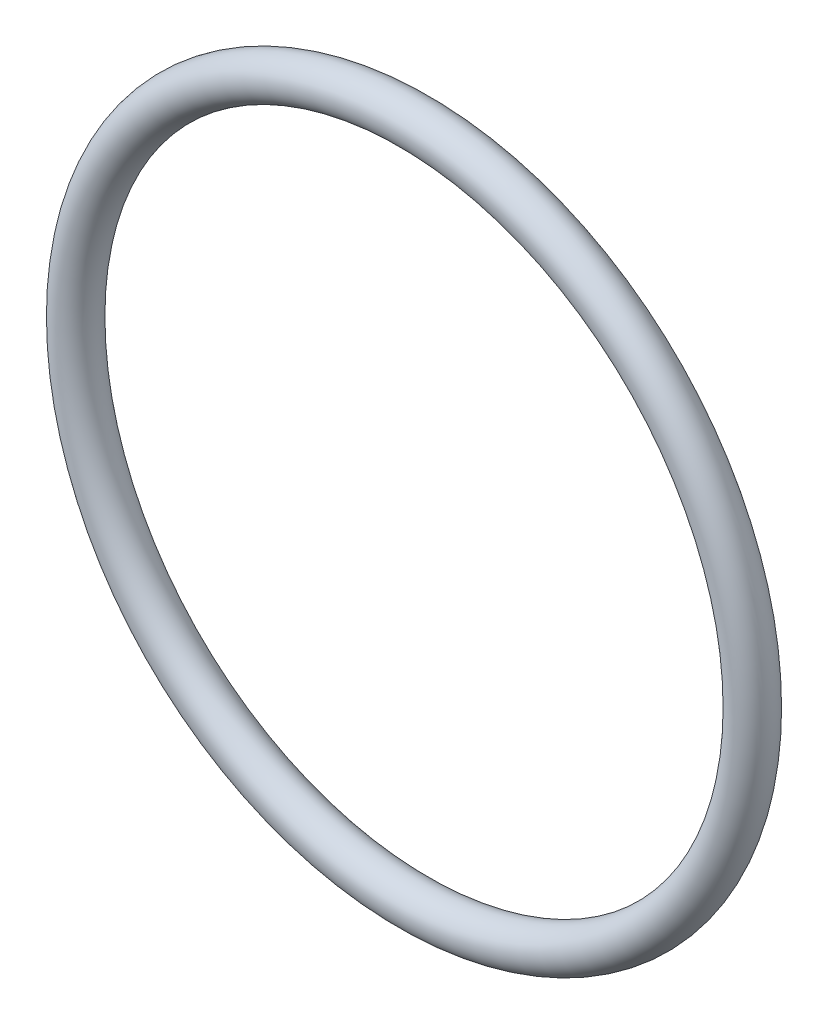
ISO-10303-21;
HEADER;
FILE_DESCRIPTION(('STEP AP214'),'2;1');
FILE_NAME('part.step','',(''),(''),'','','');
FILE_SCHEMA(('AUTOMOTIVE_DESIGN { 1 0 10303 214 1 1 1 1 }'));
ENDSEC;
DATA;
#1=APPLICATION_CONTEXT('core data for automotive mechanical design processes');
#2=APPLICATION_PROTOCOL_DEFINITION('international standard','automotive_design',2000,#1);
#3=PRODUCT_CONTEXT('',#1,'mechanical');
#4=PRODUCT('Part','Part','',(#3));
#5=PRODUCT_RELATED_PRODUCT_CATEGORY('part','',(#4));
#6=PRODUCT_DEFINITION_FORMATION('','',#4);
#7=PRODUCT_DEFINITION_CONTEXT('part definition',#1,'design');
#8=PRODUCT_DEFINITION('design','',#6,#7);
#9=PRODUCT_DEFINITION_SHAPE('','',#8);
#10=(LENGTH_UNIT() NAMED_UNIT(*) SI_UNIT(.MILLI.,.METRE.));
#11=(NAMED_UNIT(*) PLANE_ANGLE_UNIT() SI_UNIT($,.RADIAN.));
#12=(NAMED_UNIT(*) SI_UNIT($,.STERADIAN.) SOLID_ANGLE_UNIT());
#13=UNCERTAINTY_MEASURE_WITH_UNIT(LENGTH_MEASURE(1.E-05),#10,'distance_accuracy_value','');
#14=(GEOMETRIC_REPRESENTATION_CONTEXT(3) GLOBAL_UNCERTAINTY_ASSIGNED_CONTEXT((#13)) GLOBAL_UNIT_ASSIGNED_CONTEXT((#10,
#11,#12)) REPRESENTATION_CONTEXT('',''));
#15=CARTESIAN_POINT('',(0.,0.,0.));
#16=DIRECTION('',(0.,0.,1.));
#17=DIRECTION('',(1.,0.,0.));
#18=AXIS2_PLACEMENT_3D('',#15,#16,#17);
#19=CARTESIAN_POINT('',(0.,0.,0.));
#20=DIRECTION('',(0.,0.,1.));
#21=DIRECTION('',(1.,0.,0.));
#22=AXIS2_PLACEMENT_3D('',#19,#20,#21);
#23=TOROIDAL_SURFACE('',#22,43.6245,2.667);
#24=CARTESIAN_POINT('',(46.2915,0.,0.));
#25=VERTEX_POINT('',#24);
#26=VERTEX_LOOP('',#25);
#27=FACE_BOUND('',#26,.T.);
#28=ADVANCED_FACE('F35',(#27),#23,.T.);
#29=CLOSED_SHELL('',(#28));
#30=MANIFOLD_SOLID_BREP('B2',#29);
#31=ADVANCED_BREP_SHAPE_REPRESENTATION('',(#18,#30),#14);
#32=SHAPE_DEFINITION_REPRESENTATION(#9,#31);
ENDSEC;
END-ISO-10303-21;
